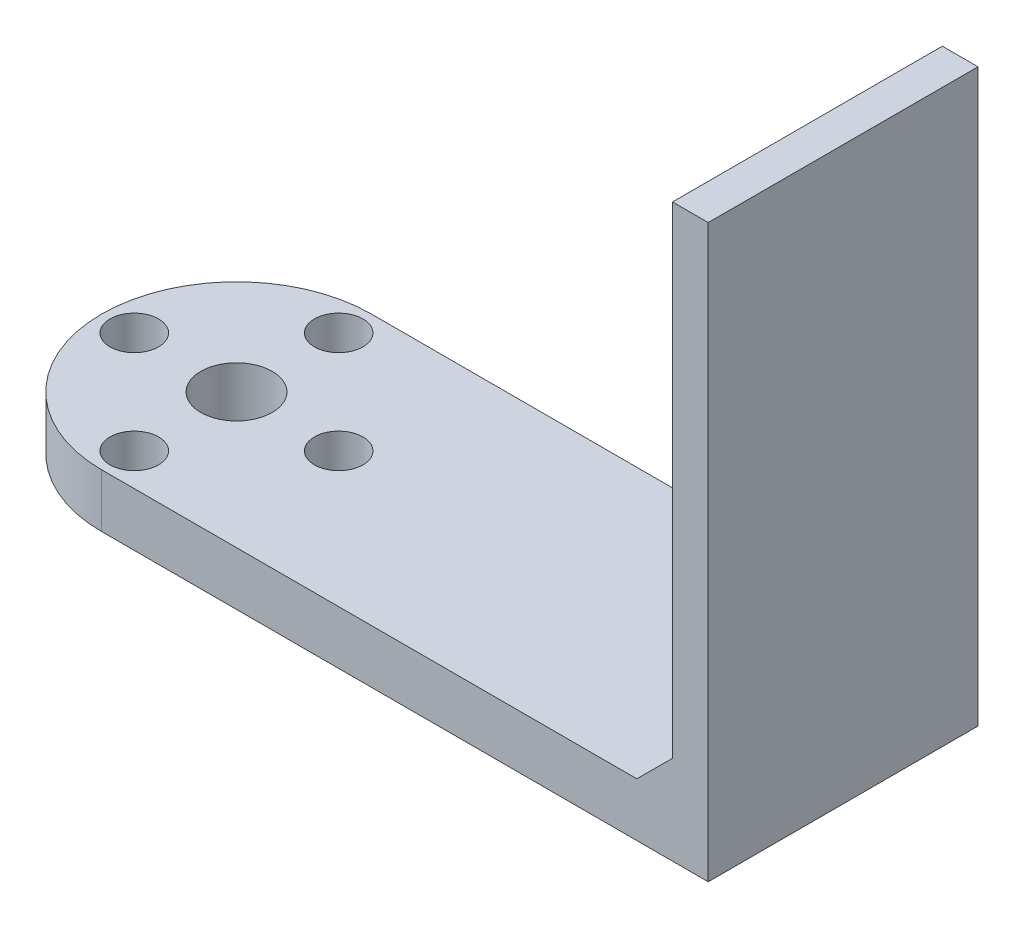
ISO-10303-21;
HEADER;
FILE_DESCRIPTION(('STEP AP214'),'2;1');
FILE_NAME('part.step','',(''),(''),'','','');
FILE_SCHEMA(('AUTOMOTIVE_DESIGN { 1 0 10303 214 1 1 1 1 }'));
ENDSEC;
DATA;
#1=APPLICATION_CONTEXT('core data for automotive mechanical design processes');
#2=APPLICATION_PROTOCOL_DEFINITION('international standard','automotive_design',2000,#1);
#3=PRODUCT_CONTEXT('',#1,'mechanical');
#4=PRODUCT('Part','Part','',(#3));
#5=PRODUCT_RELATED_PRODUCT_CATEGORY('part','',(#4));
#6=PRODUCT_DEFINITION_FORMATION('','',#4);
#7=PRODUCT_DEFINITION_CONTEXT('part definition',#1,'design');
#8=PRODUCT_DEFINITION('design','',#6,#7);
#9=PRODUCT_DEFINITION_SHAPE('','',#8);
#10=(LENGTH_UNIT() NAMED_UNIT(*) SI_UNIT(.MILLI.,.METRE.));
#11=(NAMED_UNIT(*) PLANE_ANGLE_UNIT() SI_UNIT($,.RADIAN.));
#12=(NAMED_UNIT(*) SI_UNIT($,.STERADIAN.) SOLID_ANGLE_UNIT());
#13=UNCERTAINTY_MEASURE_WITH_UNIT(LENGTH_MEASURE(1.E-05),#10,'distance_accuracy_value','');
#14=(GEOMETRIC_REPRESENTATION_CONTEXT(3) GLOBAL_UNCERTAINTY_ASSIGNED_CONTEXT((#13)) GLOBAL_UNIT_ASSIGNED_CONTEXT((#10,
#11,#12)) REPRESENTATION_CONTEXT('',''));
#15=CARTESIAN_POINT('',(0.,0.,0.));
#16=DIRECTION('',(0.,0.,1.));
#17=DIRECTION('',(1.,0.,0.));
#18=AXIS2_PLACEMENT_3D('',#15,#16,#17);
#19=CARTESIAN_POINT('',(0.,4.7625,-12.0015));
#20=DIRECTION('',(0.,0.,1.));
#21=DIRECTION('',(1.,0.,0.));
#22=AXIS2_PLACEMENT_3D('',#19,#20,#21);
#23=PLANE('',#22);
#24=DIRECTION('',(-1.,0.,0.));
#25=VECTOR('',#24,1.);
#26=CARTESIAN_POINT('',(0.,0.,-12.0015));
#27=LINE('',#26,#25);
#28=CARTESIAN_POINT('',(53.975,0.,-12.0015));
#29=VERTEX_POINT('',#28);
#30=CARTESIAN_POINT('',(0.,0.,-12.0015));
#31=VERTEX_POINT('',#30);
#32=EDGE_CURVE('E142',#29,#31,#27,.T.);
#33=ORIENTED_EDGE('',*,*,#32,.T.);
#34=DIRECTION('',(0.,-1.,0.));
#35=VECTOR('',#34,1.);
#36=CARTESIAN_POINT('',(0.,4.7625,-12.0015));
#37=LINE('',#36,#35);
#38=CARTESIAN_POINT('',(0.,4.7625,-12.0015));
#39=VERTEX_POINT('',#38);
#40=EDGE_CURVE('E144',#39,#31,#37,.T.);
#41=ORIENTED_EDGE('',*,*,#40,.F.);
#42=DIRECTION('',(-1.,0.,0.));
#43=VECTOR('',#42,1.);
#44=CARTESIAN_POINT('',(0.,4.7625,-12.0015));
#45=LINE('',#44,#43);
#46=CARTESIAN_POINT('',(47.625,4.7625,-12.0015));
#47=VERTEX_POINT('',#46);
#48=EDGE_CURVE('E172',#47,#39,#45,.T.);
#49=ORIENTED_EDGE('',*,*,#48,.F.);
#50=DIRECTION('',(0.707106781186544,0.707106781186551,0.));
#51=VECTOR('',#50,1.);
#52=CARTESIAN_POINT('',(23.8125000000002,-19.05,-12.0015));
#53=LINE('',#52,#51);
#54=CARTESIAN_POINT('',(50.8,7.93750000000001,-12.0015));
#55=VERTEX_POINT('',#54);
#56=EDGE_CURVE('E11',#47,#55,#53,.T.);
#57=ORIENTED_EDGE('',*,*,#56,.T.);
#58=DIRECTION('',(0.,-1.,0.));
#59=VECTOR('',#58,1.);
#60=CARTESIAN_POINT('',(50.8,50.8,-12.0015));
#61=LINE('',#60,#59);
#62=CARTESIAN_POINT('',(50.8,50.8,-12.0015));
#63=VERTEX_POINT('',#62);
#64=EDGE_CURVE('E95',#63,#55,#61,.T.);
#65=ORIENTED_EDGE('',*,*,#64,.F.);
#66=DIRECTION('',(-1.,0.,0.));
#67=VECTOR('',#66,1.);
#68=CARTESIAN_POINT('',(0.,50.8,-12.0015));
#69=LINE('',#68,#67);
#70=CARTESIAN_POINT('',(53.975,50.8,-12.0015));
#71=VERTEX_POINT('',#70);
#72=EDGE_CURVE('E102',#71,#63,#69,.T.);
#73=ORIENTED_EDGE('',*,*,#72,.F.);
#74=DIRECTION('',(0.,-1.,0.));
#75=VECTOR('',#74,1.);
#76=CARTESIAN_POINT('',(53.975,50.8,-12.0015));
#77=LINE('',#76,#75);
#78=EDGE_CURVE('E132',#71,#29,#77,.T.);
#79=ORIENTED_EDGE('',*,*,#78,.T.);
#80=EDGE_LOOP('',(#33,#41,#49,#57,#65,#73,#79));
#81=FACE_BOUND('',#80,.T.);
#82=ADVANCED_FACE('F33',(#81),#23,.F.);
#83=CARTESIAN_POINT('',(0.,4.7625,0.));
#84=DIRECTION('',(0.,-1.,0.));
#85=DIRECTION('',(0.,0.,-1.));
#86=AXIS2_PLACEMENT_3D('',#83,#84,#85);
#87=CYLINDRICAL_SURFACE('',#86,12.0015);
#88=CARTESIAN_POINT('',(0.,0.,0.));
#89=DIRECTION('',(0.,1.,0.));
#90=DIRECTION('',(0.,0.,1.));
#91=AXIS2_PLACEMENT_3D('',#88,#89,#90);
#92=CIRCLE('',#91,12.0015);
#93=CARTESIAN_POINT('',(0.,0.,12.0015));
#94=VERTEX_POINT('',#93);
#95=EDGE_CURVE('E146',#31,#94,#92,.T.);
#96=ORIENTED_EDGE('',*,*,#95,.T.);
#97=DIRECTION('',(0.,-1.,0.));
#98=VECTOR('',#97,1.);
#99=CARTESIAN_POINT('',(0.,4.7625,12.0015));
#100=LINE('',#99,#98);
#101=CARTESIAN_POINT('',(0.,4.7625,12.0015));
#102=VERTEX_POINT('',#101);
#103=EDGE_CURVE('E159',#102,#94,#100,.T.);
#104=ORIENTED_EDGE('',*,*,#103,.F.);
#105=CARTESIAN_POINT('',(0.,4.7625,0.));
#106=DIRECTION('',(0.,1.,0.));
#107=DIRECTION('',(0.,0.,1.));
#108=AXIS2_PLACEMENT_3D('',#105,#106,#107);
#109=CIRCLE('',#108,12.0015);
#110=EDGE_CURVE('E171',#39,#102,#109,.T.);
#111=ORIENTED_EDGE('',*,*,#110,.F.);
#112=ORIENTED_EDGE('',*,*,#40,.T.);
#113=EDGE_LOOP('',(#96,#104,#111,#112));
#114=FACE_BOUND('',#113,.T.);
#115=ADVANCED_FACE('F180',(#114),#87,.T.);
#116=CARTESIAN_POINT('',(0.,4.7625,12.0015));
#117=DIRECTION('',(0.,0.,1.));
#118=DIRECTION('',(1.,0.,0.));
#119=AXIS2_PLACEMENT_3D('',#116,#117,#118);
#120=PLANE('',#119);
#121=DIRECTION('',(-1.,0.,0.));
#122=VECTOR('',#121,1.);
#123=CARTESIAN_POINT('',(0.,0.,12.0015));
#124=LINE('',#123,#122);
#125=CARTESIAN_POINT('',(53.975,0.,12.0015));
#126=VERTEX_POINT('',#125);
#127=EDGE_CURVE('E150',#126,#94,#124,.T.);
#128=ORIENTED_EDGE('',*,*,#127,.F.);
#129=DIRECTION('',(0.,-1.,0.));
#130=VECTOR('',#129,1.);
#131=CARTESIAN_POINT('',(53.975,50.8,12.0015));
#132=LINE('',#131,#130);
#133=CARTESIAN_POINT('',(53.975,50.8,12.0015));
#134=VERTEX_POINT('',#133);
#135=EDGE_CURVE('E120',#134,#126,#132,.T.);
#136=ORIENTED_EDGE('',*,*,#135,.F.);
#137=DIRECTION('',(-1.,0.,0.));
#138=VECTOR('',#137,1.);
#139=CARTESIAN_POINT('',(0.,50.8,12.0015));
#140=LINE('',#139,#138);
#141=CARTESIAN_POINT('',(50.8,50.8,12.0015));
#142=VERTEX_POINT('',#141);
#143=EDGE_CURVE('E101',#134,#142,#140,.T.);
#144=ORIENTED_EDGE('',*,*,#143,.T.);
#145=DIRECTION('',(0.,-1.,0.));
#146=VECTOR('',#145,1.);
#147=CARTESIAN_POINT('',(50.8,50.8,12.0015));
#148=LINE('',#147,#146);
#149=CARTESIAN_POINT('',(50.8,7.93750000000001,12.0015));
#150=VERTEX_POINT('',#149);
#151=EDGE_CURVE('E97',#142,#150,#148,.T.);
#152=ORIENTED_EDGE('',*,*,#151,.T.);
#153=DIRECTION('',(-0.707106781186544,-0.707106781186551,0.));
#154=VECTOR('',#153,1.);
#155=CARTESIAN_POINT('',(50.8,7.93750000000002,12.0015));
#156=LINE('',#155,#154);
#157=CARTESIAN_POINT('',(47.625,4.7625,12.0015));
#158=VERTEX_POINT('',#157);
#159=EDGE_CURVE('E41',#150,#158,#156,.T.);
#160=ORIENTED_EDGE('',*,*,#159,.T.);
#161=DIRECTION('',(-1.,0.,0.));
#162=VECTOR('',#161,1.);
#163=CARTESIAN_POINT('',(0.,4.7625,12.0015));
#164=LINE('',#163,#162);
#165=EDGE_CURVE('E161',#158,#102,#164,.T.);
#166=ORIENTED_EDGE('',*,*,#165,.T.);
#167=ORIENTED_EDGE('',*,*,#103,.T.);
#168=EDGE_LOOP('',(#128,#136,#144,#152,#160,#166,#167));
#169=FACE_BOUND('',#168,.T.);
#170=ADVANCED_FACE('F137',(#169),#120,.T.);
#171=CARTESIAN_POINT('',(0.,4.7625,0.));
#172=DIRECTION('',(0.,-1.,0.));
#173=DIRECTION('',(0.,0.,-1.));
#174=AXIS2_PLACEMENT_3D('',#171,#172,#173);
#175=CYLINDRICAL_SURFACE('',#174,3.175);
#176=CARTESIAN_POINT('',(0.,4.7625,0.));
#177=DIRECTION('',(0.,1.,0.));
#178=DIRECTION('',(0.,0.,1.));
#179=AXIS2_PLACEMENT_3D('',#176,#177,#178);
#180=CIRCLE('',#179,3.175);
#181=CARTESIAN_POINT('',(0.,4.7625,-3.175));
#182=VERTEX_POINT('',#181);
#183=EDGE_CURVE('E240',#182,#182,#180,.T.);
#184=CARTESIAN_POINT('',(0.,0.,0.));
#185=DIRECTION('',(0.,1.,0.));
#186=DIRECTION('',(0.,0.,1.));
#187=AXIS2_PLACEMENT_3D('',#184,#185,#186);
#188=CIRCLE('',#187,3.175);
#189=CARTESIAN_POINT('',(0.,0.,-3.175));
#190=VERTEX_POINT('',#189);
#191=EDGE_CURVE('E147',#190,#190,#188,.T.);
#192=CARTESIAN_POINT('',(0.,4.7625,-3.175));
#193=CARTESIAN_POINT('',(0.,4.712890625,-3.175));
#194=CARTESIAN_POINT('',(0.,4.66328125,-3.175));
#195=CARTESIAN_POINT('',(0.,4.5640625,-3.175));
#196=CARTESIAN_POINT('',(0.,4.514453125,-3.175));
#197=CARTESIAN_POINT('',(0.,4.415234375,-3.175));
#198=CARTESIAN_POINT('',(0.,4.365625,-3.175));
#199=CARTESIAN_POINT('',(0.,4.26640625,-3.175));
#200=CARTESIAN_POINT('',(0.,4.216796875,-3.175));
#201=CARTESIAN_POINT('',(0.,4.117578125,-3.175));
#202=CARTESIAN_POINT('',(0.,4.06796875,-3.175));
#203=CARTESIAN_POINT('',(0.,3.96875,-3.175));
#204=CARTESIAN_POINT('',(0.,3.919140625,-3.175));
#205=CARTESIAN_POINT('',(0.,3.819921875,-3.175));
#206=CARTESIAN_POINT('',(0.,3.7703125,-3.175));
#207=CARTESIAN_POINT('',(0.,3.67109375,-3.175));
#208=CARTESIAN_POINT('',(0.,3.621484375,-3.175));
#209=CARTESIAN_POINT('',(0.,3.522265625,-3.175));
#210=CARTESIAN_POINT('',(0.,3.47265625,-3.175));
#211=CARTESIAN_POINT('',(0.,3.3734375,-3.175));
#212=CARTESIAN_POINT('',(0.,3.323828125,-3.175));
#213=CARTESIAN_POINT('',(0.,3.224609375,-3.175));
#214=CARTESIAN_POINT('',(0.,3.175,-3.175));
#215=CARTESIAN_POINT('',(0.,3.07578125,-3.175));
#216=CARTESIAN_POINT('',(0.,3.026171875,-3.175));
#217=CARTESIAN_POINT('',(0.,2.926953125,-3.175));
#218=CARTESIAN_POINT('',(0.,2.87734375,-3.175));
#219=CARTESIAN_POINT('',(0.,2.778125,-3.175));
#220=CARTESIAN_POINT('',(0.,2.728515625,-3.175));
#221=CARTESIAN_POINT('',(0.,2.629296875,-3.175));
#222=CARTESIAN_POINT('',(0.,2.5796875,-3.175));
#223=CARTESIAN_POINT('',(0.,2.48046875,-3.175));
#224=CARTESIAN_POINT('',(0.,2.430859375,-3.175));
#225=CARTESIAN_POINT('',(0.,2.331640625,-3.175));
#226=CARTESIAN_POINT('',(0.,2.28203125,-3.175));
#227=CARTESIAN_POINT('',(0.,2.1828125,-3.175));
#228=CARTESIAN_POINT('',(0.,2.133203125,-3.175));
#229=CARTESIAN_POINT('',(0.,2.033984375,-3.175));
#230=CARTESIAN_POINT('',(0.,1.984375,-3.175));
#231=CARTESIAN_POINT('',(0.,1.88515625,-3.175));
#232=CARTESIAN_POINT('',(0.,1.835546875,-3.175));
#233=CARTESIAN_POINT('',(0.,1.736328125,-3.175));
#234=CARTESIAN_POINT('',(0.,1.68671875,-3.175));
#235=CARTESIAN_POINT('',(0.,1.5875,-3.175));
#236=CARTESIAN_POINT('',(0.,1.537890625,-3.175));
#237=CARTESIAN_POINT('',(0.,1.438671875,-3.175));
#238=CARTESIAN_POINT('',(0.,1.3890625,-3.175));
#239=CARTESIAN_POINT('',(0.,1.28984375,-3.175));
#240=CARTESIAN_POINT('',(0.,1.240234375,-3.175));
#241=CARTESIAN_POINT('',(0.,1.141015625,-3.175));
#242=CARTESIAN_POINT('',(0.,1.09140625,-3.175));
#243=CARTESIAN_POINT('',(0.,0.9921875,-3.175));
#244=CARTESIAN_POINT('',(0.,0.942578125,-3.175));
#245=CARTESIAN_POINT('',(0.,0.843359375,-3.175));
#246=CARTESIAN_POINT('',(0.,0.79375,-3.175));
#247=CARTESIAN_POINT('',(0.,0.69453125,-3.175));
#248=CARTESIAN_POINT('',(0.,0.644921875,-3.175));
#249=CARTESIAN_POINT('',(0.,0.545703125,-3.175));
#250=CARTESIAN_POINT('',(0.,0.49609375,-3.175));
#251=CARTESIAN_POINT('',(0.,0.396875,-3.175));
#252=CARTESIAN_POINT('',(0.,0.347265625,-3.175));
#253=CARTESIAN_POINT('',(0.,0.248046875,-3.175));
#254=CARTESIAN_POINT('',(0.,0.1984375,-3.175));
#255=CARTESIAN_POINT('',(0.,0.09921875,-3.175));
#256=CARTESIAN_POINT('',(0.,0.049609375,-3.175));
#257=CARTESIAN_POINT('',(0.,0.,-3.175));
#258=B_SPLINE_CURVE_WITH_KNOTS('',3,(#192,#193,#194,#195,#196,#197,#198,#199,#200,#201,#202,
#203,#204,#205,#206,#207,#208,#209,#210,#211,#212,#213,#214,#215,#216,#217,#218,#219,#220,#221,
#222,#223,#224,#225,#226,#227,#228,#229,#230,#231,#232,#233,#234,#235,#236,#237,#238,#239,#240,
#241,#242,#243,#244,#245,#246,#247,#248,#249,#250,#251,#252,#253,#254,#255,#256,#257),
.UNSPECIFIED.,.F.,.F.,(4,2,2,2,2,2,2,2,2,2,2,2,2,2,2,2,2,2,2,2,2,2,2,2,2,2,2,2,2,2,2,2,4),(0.,
0.148828124999999,0.297656249999999,0.446484374999999,0.595312499999999,0.744140625,0.89296875,
1.041796875,1.190625,1.339453125,1.48828125,1.637109375,1.7859375,1.934765625,2.08359375,
2.232421875,2.38125,2.530078125,2.67890625,2.827734375,2.9765625,3.125390625,3.27421875,
3.423046875,3.571875,3.720703125,3.86953125,4.018359375,4.1671875,4.316015625,4.46484375,
4.613671875,4.7625),.UNSPECIFIED.);
#259=EDGE_CURVE('BSEAM189',#182,#190,#258,.T.);
#260=ORIENTED_EDGE('',*,*,#183,.T.);
#261=ORIENTED_EDGE('',*,*,#191,.F.);
#262=ORIENTED_EDGE('',*,*,#259,.T.);
#263=ORIENTED_EDGE('',*,*,#259,.F.);
#264=EDGE_LOOP('',(#260,#262,#261,#263));
#265=FACE_BOUND('',#264,.T.);
#266=ADVANCED_FACE('F189',(#265),#175,.F.);
#267=CARTESIAN_POINT('',(0.,4.7625,-9.0932));
#268=DIRECTION('',(0.,-1.,0.));
#269=DIRECTION('',(0.,0.,-1.));
#270=AXIS2_PLACEMENT_3D('',#267,#268,#269);
#271=CYLINDRICAL_SURFACE('',#270,2.159);
#272=CARTESIAN_POINT('',(0.,4.7625,-9.0932));
#273=DIRECTION('',(0.,1.,0.));
#274=DIRECTION('',(0.,0.,1.));
#275=AXIS2_PLACEMENT_3D('',#272,#273,#274);
#276=CIRCLE('',#275,2.159);
#277=CARTESIAN_POINT('',(0.,4.7625,-11.2522));
#278=VERTEX_POINT('',#277);
#279=EDGE_CURVE('E243',#278,#278,#276,.T.);
#280=CARTESIAN_POINT('',(0.,0.,-9.0932));
#281=DIRECTION('',(0.,1.,0.));
#282=DIRECTION('',(0.,0.,1.));
#283=AXIS2_PLACEMENT_3D('',#280,#281,#282);
#284=CIRCLE('',#283,2.159);
#285=CARTESIAN_POINT('',(0.,0.,-11.2522));
#286=VERTEX_POINT('',#285);
#287=EDGE_CURVE('E153',#286,#286,#284,.T.);
#288=CARTESIAN_POINT('',(0.,4.7625,-11.2522));
#289=CARTESIAN_POINT('',(0.,4.712890625,-11.2522));
#290=CARTESIAN_POINT('',(0.,4.66328125,-11.2522));
#291=CARTESIAN_POINT('',(0.,4.5640625,-11.2522));
#292=CARTESIAN_POINT('',(0.,4.514453125,-11.2522));
#293=CARTESIAN_POINT('',(0.,4.415234375,-11.2522));
#294=CARTESIAN_POINT('',(0.,4.365625,-11.2522));
#295=CARTESIAN_POINT('',(0.,4.26640625,-11.2522));
#296=CARTESIAN_POINT('',(0.,4.216796875,-11.2522));
#297=CARTESIAN_POINT('',(0.,4.117578125,-11.2522));
#298=CARTESIAN_POINT('',(0.,4.06796875,-11.2522));
#299=CARTESIAN_POINT('',(0.,3.96875,-11.2522));
#300=CARTESIAN_POINT('',(0.,3.919140625,-11.2522));
#301=CARTESIAN_POINT('',(0.,3.819921875,-11.2522));
#302=CARTESIAN_POINT('',(0.,3.7703125,-11.2522));
#303=CARTESIAN_POINT('',(0.,3.67109375,-11.2522));
#304=CARTESIAN_POINT('',(0.,3.621484375,-11.2522));
#305=CARTESIAN_POINT('',(0.,3.522265625,-11.2522));
#306=CARTESIAN_POINT('',(0.,3.47265625,-11.2522));
#307=CARTESIAN_POINT('',(0.,3.3734375,-11.2522));
#308=CARTESIAN_POINT('',(0.,3.323828125,-11.2522));
#309=CARTESIAN_POINT('',(0.,3.224609375,-11.2522));
#310=CARTESIAN_POINT('',(0.,3.175,-11.2522));
#311=CARTESIAN_POINT('',(0.,3.07578125,-11.2522));
#312=CARTESIAN_POINT('',(0.,3.026171875,-11.2522));
#313=CARTESIAN_POINT('',(0.,2.926953125,-11.2522));
#314=CARTESIAN_POINT('',(0.,2.87734375,-11.2522));
#315=CARTESIAN_POINT('',(0.,2.778125,-11.2522));
#316=CARTESIAN_POINT('',(0.,2.728515625,-11.2522));
#317=CARTESIAN_POINT('',(0.,2.629296875,-11.2522));
#318=CARTESIAN_POINT('',(0.,2.5796875,-11.2522));
#319=CARTESIAN_POINT('',(0.,2.48046875,-11.2522));
#320=CARTESIAN_POINT('',(0.,2.430859375,-11.2522));
#321=CARTESIAN_POINT('',(0.,2.331640625,-11.2522));
#322=CARTESIAN_POINT('',(0.,2.28203125,-11.2522));
#323=CARTESIAN_POINT('',(0.,2.1828125,-11.2522));
#324=CARTESIAN_POINT('',(0.,2.133203125,-11.2522));
#325=CARTESIAN_POINT('',(0.,2.033984375,-11.2522));
#326=CARTESIAN_POINT('',(0.,1.984375,-11.2522));
#327=CARTESIAN_POINT('',(0.,1.88515625,-11.2522));
#328=CARTESIAN_POINT('',(0.,1.835546875,-11.2522));
#329=CARTESIAN_POINT('',(0.,1.736328125,-11.2522));
#330=CARTESIAN_POINT('',(0.,1.68671875,-11.2522));
#331=CARTESIAN_POINT('',(0.,1.5875,-11.2522));
#332=CARTESIAN_POINT('',(0.,1.537890625,-11.2522));
#333=CARTESIAN_POINT('',(0.,1.438671875,-11.2522));
#334=CARTESIAN_POINT('',(0.,1.3890625,-11.2522));
#335=CARTESIAN_POINT('',(0.,1.28984375,-11.2522));
#336=CARTESIAN_POINT('',(0.,1.240234375,-11.2522));
#337=CARTESIAN_POINT('',(0.,1.141015625,-11.2522));
#338=CARTESIAN_POINT('',(0.,1.09140625,-11.2522));
#339=CARTESIAN_POINT('',(0.,0.9921875,-11.2522));
#340=CARTESIAN_POINT('',(0.,0.942578125,-11.2522));
#341=CARTESIAN_POINT('',(0.,0.843359375,-11.2522));
#342=CARTESIAN_POINT('',(0.,0.79375,-11.2522));
#343=CARTESIAN_POINT('',(0.,0.69453125,-11.2522));
#344=CARTESIAN_POINT('',(0.,0.644921875,-11.2522));
#345=CARTESIAN_POINT('',(0.,0.545703125,-11.2522));
#346=CARTESIAN_POINT('',(0.,0.49609375,-11.2522));
#347=CARTESIAN_POINT('',(0.,0.396875,-11.2522));
#348=CARTESIAN_POINT('',(0.,0.347265625,-11.2522));
#349=CARTESIAN_POINT('',(0.,0.248046875,-11.2522));
#350=CARTESIAN_POINT('',(0.,0.1984375,-11.2522));
#351=CARTESIAN_POINT('',(0.,0.09921875,-11.2522));
#352=CARTESIAN_POINT('',(0.,0.049609375,-11.2522));
#353=CARTESIAN_POINT('',(0.,0.,-11.2522));
#354=B_SPLINE_CURVE_WITH_KNOTS('',3,(#288,#289,#290,#291,#292,#293,#294,#295,#296,#297,#298,
#299,#300,#301,#302,#303,#304,#305,#306,#307,#308,#309,#310,#311,#312,#313,#314,#315,#316,#317,
#318,#319,#320,#321,#322,#323,#324,#325,#326,#327,#328,#329,#330,#331,#332,#333,#334,#335,#336,
#337,#338,#339,#340,#341,#342,#343,#344,#345,#346,#347,#348,#349,#350,#351,#352,#353),
.UNSPECIFIED.,.F.,.F.,(4,2,2,2,2,2,2,2,2,2,2,2,2,2,2,2,2,2,2,2,2,2,2,2,2,2,2,2,2,2,2,2,4),(0.,
0.148828124999999,0.297656249999999,0.446484374999999,0.595312499999999,0.744140625,0.89296875,
1.041796875,1.190625,1.339453125,1.48828125,1.637109375,1.7859375,1.934765625,2.08359375,
2.232421875,2.38125,2.530078125,2.67890625,2.827734375,2.9765625,3.125390625,3.27421875,
3.423046875,3.571875,3.720703125,3.86953125,4.018359375,4.1671875,4.316015625,4.46484375,
4.613671875,4.7625),.UNSPECIFIED.);
#355=EDGE_CURVE('BSEAM192',#278,#286,#354,.T.);
#356=ORIENTED_EDGE('',*,*,#279,.T.);
#357=ORIENTED_EDGE('',*,*,#287,.F.);
#358=ORIENTED_EDGE('',*,*,#355,.T.);
#359=ORIENTED_EDGE('',*,*,#355,.F.);
#360=EDGE_LOOP('',(#356,#358,#357,#359));
#361=FACE_BOUND('',#360,.T.);
#362=ADVANCED_FACE('F192',(#361),#271,.F.);
#363=CARTESIAN_POINT('',(9.09320000000026,4.7625,-2.57330692365149E-13));
#364=DIRECTION('',(0.,-1.,0.));
#365=DIRECTION('',(0.,0.,-1.));
#366=AXIS2_PLACEMENT_3D('',#363,#364,#365);
#367=CYLINDRICAL_SURFACE('',#366,2.1590000000002);
#368=CARTESIAN_POINT('',(9.09320000000026,4.7625,-2.57330692365149E-13));
#369=DIRECTION('',(0.,1.,0.));
#370=DIRECTION('',(0.,0.,1.));
#371=AXIS2_PLACEMENT_3D('',#368,#369,#370);
#372=CIRCLE('',#371,2.1590000000002);
#373=CARTESIAN_POINT('',(9.09320000000026,4.7625,-2.15900000000046));
#374=VERTEX_POINT('',#373);
#375=EDGE_CURVE('E246',#374,#374,#372,.T.);
#376=CARTESIAN_POINT('',(9.09320000000026,0.,-2.57330692365149E-13));
#377=DIRECTION('',(0.,1.,0.));
#378=DIRECTION('',(0.,0.,1.));
#379=AXIS2_PLACEMENT_3D('',#376,#377,#378);
#380=CIRCLE('',#379,2.1590000000002);
#381=CARTESIAN_POINT('',(9.09320000000026,0.,-2.15900000000046));
#382=VERTEX_POINT('',#381);
#383=EDGE_CURVE('E228',#382,#382,#380,.T.);
#384=CARTESIAN_POINT('',(9.09320000000026,4.7625,-2.15900000000046));
#385=CARTESIAN_POINT('',(9.09320000000026,4.712890625,-2.15900000000046));
#386=CARTESIAN_POINT('',(9.09320000000026,4.66328125,-2.15900000000046));
#387=CARTESIAN_POINT('',(9.09320000000026,4.5640625,-2.15900000000046));
#388=CARTESIAN_POINT('',(9.09320000000026,4.514453125,-2.15900000000046));
#389=CARTESIAN_POINT('',(9.09320000000026,4.415234375,-2.15900000000046));
#390=CARTESIAN_POINT('',(9.09320000000026,4.365625,-2.15900000000046));
#391=CARTESIAN_POINT('',(9.09320000000026,4.26640625,-2.15900000000046));
#392=CARTESIAN_POINT('',(9.09320000000026,4.216796875,-2.15900000000046));
#393=CARTESIAN_POINT('',(9.09320000000026,4.117578125,-2.15900000000046));
#394=CARTESIAN_POINT('',(9.09320000000026,4.06796875,-2.15900000000046));
#395=CARTESIAN_POINT('',(9.09320000000026,3.96875,-2.15900000000046));
#396=CARTESIAN_POINT('',(9.09320000000026,3.919140625,-2.15900000000046));
#397=CARTESIAN_POINT('',(9.09320000000026,3.819921875,-2.15900000000046));
#398=CARTESIAN_POINT('',(9.09320000000026,3.7703125,-2.15900000000046));
#399=CARTESIAN_POINT('',(9.09320000000026,3.67109375,-2.15900000000046));
#400=CARTESIAN_POINT('',(9.09320000000026,3.621484375,-2.15900000000046));
#401=CARTESIAN_POINT('',(9.09320000000026,3.522265625,-2.15900000000046));
#402=CARTESIAN_POINT('',(9.09320000000026,3.47265625,-2.15900000000046));
#403=CARTESIAN_POINT('',(9.09320000000026,3.3734375,-2.15900000000046));
#404=CARTESIAN_POINT('',(9.09320000000026,3.323828125,-2.15900000000046));
#405=CARTESIAN_POINT('',(9.09320000000026,3.224609375,-2.15900000000046));
#406=CARTESIAN_POINT('',(9.09320000000026,3.175,-2.15900000000046));
#407=CARTESIAN_POINT('',(9.09320000000026,3.07578125,-2.15900000000046));
#408=CARTESIAN_POINT('',(9.09320000000026,3.026171875,-2.15900000000046));
#409=CARTESIAN_POINT('',(9.09320000000026,2.926953125,-2.15900000000046));
#410=CARTESIAN_POINT('',(9.09320000000026,2.87734375,-2.15900000000046));
#411=CARTESIAN_POINT('',(9.09320000000026,2.778125,-2.15900000000046));
#412=CARTESIAN_POINT('',(9.09320000000026,2.728515625,-2.15900000000046));
#413=CARTESIAN_POINT('',(9.09320000000026,2.629296875,-2.15900000000046));
#414=CARTESIAN_POINT('',(9.09320000000026,2.5796875,-2.15900000000046));
#415=CARTESIAN_POINT('',(9.09320000000026,2.48046875,-2.15900000000046));
#416=CARTESIAN_POINT('',(9.09320000000026,2.430859375,-2.15900000000046));
#417=CARTESIAN_POINT('',(9.09320000000026,2.331640625,-2.15900000000046));
#418=CARTESIAN_POINT('',(9.09320000000026,2.28203125,-2.15900000000046));
#419=CARTESIAN_POINT('',(9.09320000000026,2.1828125,-2.15900000000046));
#420=CARTESIAN_POINT('',(9.09320000000026,2.133203125,-2.15900000000046));
#421=CARTESIAN_POINT('',(9.09320000000026,2.033984375,-2.15900000000046));
#422=CARTESIAN_POINT('',(9.09320000000026,1.984375,-2.15900000000046));
#423=CARTESIAN_POINT('',(9.09320000000026,1.88515625,-2.15900000000046));
#424=CARTESIAN_POINT('',(9.09320000000026,1.835546875,-2.15900000000046));
#425=CARTESIAN_POINT('',(9.09320000000026,1.736328125,-2.15900000000046));
#426=CARTESIAN_POINT('',(9.09320000000026,1.68671875,-2.15900000000046));
#427=CARTESIAN_POINT('',(9.09320000000026,1.5875,-2.15900000000046));
#428=CARTESIAN_POINT('',(9.09320000000026,1.537890625,-2.15900000000046));
#429=CARTESIAN_POINT('',(9.09320000000026,1.438671875,-2.15900000000046));
#430=CARTESIAN_POINT('',(9.09320000000026,1.3890625,-2.15900000000046));
#431=CARTESIAN_POINT('',(9.09320000000026,1.28984375,-2.15900000000046));
#432=CARTESIAN_POINT('',(9.09320000000026,1.240234375,-2.15900000000046));
#433=CARTESIAN_POINT('',(9.09320000000026,1.141015625,-2.15900000000046));
#434=CARTESIAN_POINT('',(9.09320000000026,1.09140625,-2.15900000000046));
#435=CARTESIAN_POINT('',(9.09320000000026,0.9921875,-2.15900000000046));
#436=CARTESIAN_POINT('',(9.09320000000026,0.942578125,-2.15900000000046));
#437=CARTESIAN_POINT('',(9.09320000000026,0.843359375,-2.15900000000046));
#438=CARTESIAN_POINT('',(9.09320000000026,0.79375,-2.15900000000046));
#439=CARTESIAN_POINT('',(9.09320000000026,0.69453125,-2.15900000000046));
#440=CARTESIAN_POINT('',(9.09320000000026,0.644921875,-2.15900000000046));
#441=CARTESIAN_POINT('',(9.09320000000026,0.545703125,-2.15900000000046));
#442=CARTESIAN_POINT('',(9.09320000000026,0.49609375,-2.15900000000046));
#443=CARTESIAN_POINT('',(9.09320000000026,0.396875,-2.15900000000046));
#444=CARTESIAN_POINT('',(9.09320000000026,0.347265625,-2.15900000000046));
#445=CARTESIAN_POINT('',(9.09320000000026,0.248046875,-2.15900000000046));
#446=CARTESIAN_POINT('',(9.09320000000026,0.1984375,-2.15900000000046));
#447=CARTESIAN_POINT('',(9.09320000000026,0.09921875,-2.15900000000046));
#448=CARTESIAN_POINT('',(9.09320000000026,0.049609375,-2.15900000000046));
#449=CARTESIAN_POINT('',(9.09320000000026,0.,-2.15900000000046));
#450=B_SPLINE_CURVE_WITH_KNOTS('',3,(#384,#385,#386,#387,#388,#389,#390,#391,#392,#393,#394,
#395,#396,#397,#398,#399,#400,#401,#402,#403,#404,#405,#406,#407,#408,#409,#410,#411,#412,#413,
#414,#415,#416,#417,#418,#419,#420,#421,#422,#423,#424,#425,#426,#427,#428,#429,#430,#431,#432,
#433,#434,#435,#436,#437,#438,#439,#440,#441,#442,#443,#444,#445,#446,#447,#448,#449),
.UNSPECIFIED.,.F.,.F.,(4,2,2,2,2,2,2,2,2,2,2,2,2,2,2,2,2,2,2,2,2,2,2,2,2,2,2,2,2,2,2,2,4),(0.,
0.148828124999999,0.297656249999999,0.446484374999999,0.595312499999999,0.744140625,0.89296875,
1.041796875,1.190625,1.339453125,1.48828125,1.637109375,1.7859375,1.934765625,2.08359375,
2.232421875,2.38125,2.530078125,2.67890625,2.827734375,2.9765625,3.125390625,3.27421875,
3.423046875,3.571875,3.720703125,3.86953125,4.018359375,4.1671875,4.316015625,4.46484375,
4.613671875,4.7625),.UNSPECIFIED.);
#451=EDGE_CURVE('BSEAM196',#374,#382,#450,.T.);
#452=ORIENTED_EDGE('',*,*,#375,.T.);
#453=ORIENTED_EDGE('',*,*,#383,.F.);
#454=ORIENTED_EDGE('',*,*,#451,.T.);
#455=ORIENTED_EDGE('',*,*,#451,.F.);
#456=EDGE_LOOP('',(#452,#454,#453,#455));
#457=FACE_BOUND('',#456,.T.);
#458=ADVANCED_FACE('F196',(#457),#367,.F.);
#459=CARTESIAN_POINT('',(5.14661384730298E-13,4.7625,9.0932));
#460=DIRECTION('',(0.,-1.,0.));
#461=DIRECTION('',(0.,0.,-1.));
#462=AXIS2_PLACEMENT_3D('',#459,#460,#461);
#463=CYLINDRICAL_SURFACE('',#462,2.15900000000055);
#464=CARTESIAN_POINT('',(5.14661384730298E-13,4.7625,9.0932));
#465=DIRECTION('',(0.,1.,0.));
#466=DIRECTION('',(0.,0.,1.));
#467=AXIS2_PLACEMENT_3D('',#464,#465,#466);
#468=CIRCLE('',#467,2.15900000000055);
#469=CARTESIAN_POINT('',(5.14661384730298E-13,4.7625,6.93419999999945));
#470=VERTEX_POINT('',#469);
#471=EDGE_CURVE('E248',#470,#470,#468,.T.);
#472=CARTESIAN_POINT('',(5.14661384730298E-13,0.,9.0932));
#473=DIRECTION('',(0.,1.,0.));
#474=DIRECTION('',(0.,0.,1.));
#475=AXIS2_PLACEMENT_3D('',#472,#473,#474);
#476=CIRCLE('',#475,2.15900000000055);
#477=CARTESIAN_POINT('',(5.14661384730298E-13,0.,6.93419999999945));
#478=VERTEX_POINT('',#477);
#479=EDGE_CURVE('E118',#478,#478,#476,.T.);
#480=CARTESIAN_POINT('',(5.14661384730298E-13,4.7625,6.93419999999945));
#481=CARTESIAN_POINT('',(5.14661384730298E-13,4.712890625,6.93419999999945));
#482=CARTESIAN_POINT('',(5.14661384730298E-13,4.66328125,6.93419999999945));
#483=CARTESIAN_POINT('',(5.14661384730298E-13,4.5640625,6.93419999999945));
#484=CARTESIAN_POINT('',(5.14661384730298E-13,4.514453125,6.93419999999945));
#485=CARTESIAN_POINT('',(5.14661384730298E-13,4.415234375,6.93419999999945));
#486=CARTESIAN_POINT('',(5.14661384730298E-13,4.365625,6.93419999999945));
#487=CARTESIAN_POINT('',(5.14661384730298E-13,4.26640625,6.93419999999945));
#488=CARTESIAN_POINT('',(5.14661384730298E-13,4.216796875,6.93419999999945));
#489=CARTESIAN_POINT('',(5.14661384730298E-13,4.117578125,6.93419999999945));
#490=CARTESIAN_POINT('',(5.14661384730298E-13,4.06796875,6.93419999999945));
#491=CARTESIAN_POINT('',(5.14661384730298E-13,3.96875,6.93419999999945));
#492=CARTESIAN_POINT('',(5.14661384730298E-13,3.919140625,6.93419999999945));
#493=CARTESIAN_POINT('',(5.14661384730298E-13,3.819921875,6.93419999999945));
#494=CARTESIAN_POINT('',(5.14661384730298E-13,3.7703125,6.93419999999945));
#495=CARTESIAN_POINT('',(5.14661384730298E-13,3.67109375,6.93419999999945));
#496=CARTESIAN_POINT('',(5.14661384730298E-13,3.621484375,6.93419999999945));
#497=CARTESIAN_POINT('',(5.14661384730298E-13,3.522265625,6.93419999999945));
#498=CARTESIAN_POINT('',(5.14661384730298E-13,3.47265625,6.93419999999945));
#499=CARTESIAN_POINT('',(5.14661384730298E-13,3.3734375,6.93419999999945));
#500=CARTESIAN_POINT('',(5.14661384730298E-13,3.323828125,6.93419999999945));
#501=CARTESIAN_POINT('',(5.14661384730298E-13,3.224609375,6.93419999999945));
#502=CARTESIAN_POINT('',(5.14661384730298E-13,3.175,6.93419999999945));
#503=CARTESIAN_POINT('',(5.14661384730298E-13,3.07578125,6.93419999999945));
#504=CARTESIAN_POINT('',(5.14661384730298E-13,3.026171875,6.93419999999945));
#505=CARTESIAN_POINT('',(5.14661384730298E-13,2.926953125,6.93419999999945));
#506=CARTESIAN_POINT('',(5.14661384730298E-13,2.87734375,6.93419999999945));
#507=CARTESIAN_POINT('',(5.14661384730298E-13,2.778125,6.93419999999945));
#508=CARTESIAN_POINT('',(5.14661384730298E-13,2.728515625,6.93419999999945));
#509=CARTESIAN_POINT('',(5.14661384730298E-13,2.629296875,6.93419999999945));
#510=CARTESIAN_POINT('',(5.14661384730298E-13,2.5796875,6.93419999999945));
#511=CARTESIAN_POINT('',(5.14661384730298E-13,2.48046875,6.93419999999945));
#512=CARTESIAN_POINT('',(5.14661384730298E-13,2.430859375,6.93419999999945));
#513=CARTESIAN_POINT('',(5.14661384730298E-13,2.331640625,6.93419999999945));
#514=CARTESIAN_POINT('',(5.14661384730298E-13,2.28203125,6.93419999999945));
#515=CARTESIAN_POINT('',(5.14661384730298E-13,2.1828125,6.93419999999945));
#516=CARTESIAN_POINT('',(5.14661384730298E-13,2.133203125,6.93419999999945));
#517=CARTESIAN_POINT('',(5.14661384730298E-13,2.033984375,6.93419999999945));
#518=CARTESIAN_POINT('',(5.14661384730298E-13,1.984375,6.93419999999945));
#519=CARTESIAN_POINT('',(5.14661384730298E-13,1.88515625,6.93419999999945));
#520=CARTESIAN_POINT('',(5.14661384730298E-13,1.835546875,6.93419999999945));
#521=CARTESIAN_POINT('',(5.14661384730298E-13,1.736328125,6.93419999999945));
#522=CARTESIAN_POINT('',(5.14661384730298E-13,1.68671875,6.93419999999945));
#523=CARTESIAN_POINT('',(5.14661384730298E-13,1.5875,6.93419999999945));
#524=CARTESIAN_POINT('',(5.14661384730298E-13,1.537890625,6.93419999999945));
#525=CARTESIAN_POINT('',(5.14661384730298E-13,1.438671875,6.93419999999945));
#526=CARTESIAN_POINT('',(5.14661384730298E-13,1.3890625,6.93419999999945));
#527=CARTESIAN_POINT('',(5.14661384730298E-13,1.28984375,6.93419999999945));
#528=CARTESIAN_POINT('',(5.14661384730298E-13,1.240234375,6.93419999999945));
#529=CARTESIAN_POINT('',(5.14661384730298E-13,1.141015625,6.93419999999945));
#530=CARTESIAN_POINT('',(5.14661384730298E-13,1.09140625,6.93419999999945));
#531=CARTESIAN_POINT('',(5.14661384730298E-13,0.9921875,6.93419999999945));
#532=CARTESIAN_POINT('',(5.14661384730298E-13,0.942578125,6.93419999999945));
#533=CARTESIAN_POINT('',(5.14661384730298E-13,0.843359375,6.93419999999945));
#534=CARTESIAN_POINT('',(5.14661384730298E-13,0.79375,6.93419999999945));
#535=CARTESIAN_POINT('',(5.14661384730298E-13,0.69453125,6.93419999999945));
#536=CARTESIAN_POINT('',(5.14661384730298E-13,0.644921875,6.93419999999945));
#537=CARTESIAN_POINT('',(5.14661384730298E-13,0.545703125,6.93419999999945));
#538=CARTESIAN_POINT('',(5.14661384730298E-13,0.49609375,6.93419999999945));
#539=CARTESIAN_POINT('',(5.14661384730298E-13,0.396875,6.93419999999945));
#540=CARTESIAN_POINT('',(5.14661384730298E-13,0.347265625,6.93419999999945));
#541=CARTESIAN_POINT('',(5.14661384730298E-13,0.248046875,6.93419999999945));
#542=CARTESIAN_POINT('',(5.14661384730298E-13,0.1984375,6.93419999999945));
#543=CARTESIAN_POINT('',(5.14661384730298E-13,0.09921875,6.93419999999945));
#544=CARTESIAN_POINT('',(5.14661384730298E-13,0.049609375,6.93419999999945));
#545=CARTESIAN_POINT('',(5.14661384730298E-13,0.,6.93419999999945));
#546=B_SPLINE_CURVE_WITH_KNOTS('',3,(#480,#481,#482,#483,#484,#485,#486,#487,#488,#489,#490,
#491,#492,#493,#494,#495,#496,#497,#498,#499,#500,#501,#502,#503,#504,#505,#506,#507,#508,#509,
#510,#511,#512,#513,#514,#515,#516,#517,#518,#519,#520,#521,#522,#523,#524,#525,#526,#527,#528,
#529,#530,#531,#532,#533,#534,#535,#536,#537,#538,#539,#540,#541,#542,#543,#544,#545),
.UNSPECIFIED.,.F.,.F.,(4,2,2,2,2,2,2,2,2,2,2,2,2,2,2,2,2,2,2,2,2,2,2,2,2,2,2,2,2,2,2,2,4),(0.,
0.148828124999999,0.297656249999999,0.446484374999999,0.595312499999999,0.744140625,0.89296875,
1.041796875,1.190625,1.339453125,1.48828125,1.637109375,1.7859375,1.934765625,2.08359375,
2.232421875,2.38125,2.530078125,2.67890625,2.827734375,2.9765625,3.125390625,3.27421875,
3.423046875,3.571875,3.720703125,3.86953125,4.018359375,4.1671875,4.316015625,4.46484375,
4.613671875,4.7625),.UNSPECIFIED.);
#547=EDGE_CURVE('BSEAM200',#470,#478,#546,.T.);
#548=ORIENTED_EDGE('',*,*,#471,.T.);
#549=ORIENTED_EDGE('',*,*,#479,.F.);
#550=ORIENTED_EDGE('',*,*,#547,.T.);
#551=ORIENTED_EDGE('',*,*,#547,.F.);
#552=EDGE_LOOP('',(#548,#550,#549,#551));
#553=FACE_BOUND('',#552,.T.);
#554=ADVANCED_FACE('F200',(#553),#463,.F.);
#555=CARTESIAN_POINT('',(-9.09319999999974,4.7625,2.5844428819255E-13));
#556=DIRECTION('',(0.,-1.,0.));
#557=DIRECTION('',(0.,0.,-1.));
#558=AXIS2_PLACEMENT_3D('',#555,#556,#557);
#559=CYLINDRICAL_SURFACE('',#558,2.15900000000041);
#560=CARTESIAN_POINT('',(-9.09319999999974,4.7625,2.5844428819255E-13));
#561=DIRECTION('',(0.,1.,0.));
#562=DIRECTION('',(0.,0.,1.));
#563=AXIS2_PLACEMENT_3D('',#560,#561,#562);
#564=CIRCLE('',#563,2.15900000000041);
#565=CARTESIAN_POINT('',(-9.09319999999974,4.7625,-2.15900000000016));
#566=VERTEX_POINT('',#565);
#567=EDGE_CURVE('E125',#566,#566,#564,.T.);
#568=CARTESIAN_POINT('',(-9.09319999999974,0.,2.5844428819255E-13));
#569=DIRECTION('',(0.,1.,0.));
#570=DIRECTION('',(0.,0.,1.));
#571=AXIS2_PLACEMENT_3D('',#568,#569,#570);
#572=CIRCLE('',#571,2.15900000000041);
#573=CARTESIAN_POINT('',(-9.09319999999974,0.,-2.15900000000016));
#574=VERTEX_POINT('',#573);
#575=EDGE_CURVE('E115',#574,#574,#572,.T.);
#576=CARTESIAN_POINT('',(-9.09319999999974,4.7625,-2.15900000000016));
#577=CARTESIAN_POINT('',(-9.09319999999974,4.712890625,-2.15900000000016));
#578=CARTESIAN_POINT('',(-9.09319999999974,4.66328125,-2.15900000000016));
#579=CARTESIAN_POINT('',(-9.09319999999974,4.5640625,-2.15900000000016));
#580=CARTESIAN_POINT('',(-9.09319999999974,4.514453125,-2.15900000000016));
#581=CARTESIAN_POINT('',(-9.09319999999974,4.415234375,-2.15900000000016));
#582=CARTESIAN_POINT('',(-9.09319999999974,4.365625,-2.15900000000016));
#583=CARTESIAN_POINT('',(-9.09319999999974,4.26640625,-2.15900000000016));
#584=CARTESIAN_POINT('',(-9.09319999999974,4.216796875,-2.15900000000016));
#585=CARTESIAN_POINT('',(-9.09319999999974,4.117578125,-2.15900000000016));
#586=CARTESIAN_POINT('',(-9.09319999999974,4.06796875,-2.15900000000016));
#587=CARTESIAN_POINT('',(-9.09319999999974,3.96875,-2.15900000000016));
#588=CARTESIAN_POINT('',(-9.09319999999974,3.919140625,-2.15900000000016));
#589=CARTESIAN_POINT('',(-9.09319999999974,3.819921875,-2.15900000000016));
#590=CARTESIAN_POINT('',(-9.09319999999974,3.7703125,-2.15900000000016));
#591=CARTESIAN_POINT('',(-9.09319999999974,3.67109375,-2.15900000000016));
#592=CARTESIAN_POINT('',(-9.09319999999974,3.621484375,-2.15900000000016));
#593=CARTESIAN_POINT('',(-9.09319999999974,3.522265625,-2.15900000000016));
#594=CARTESIAN_POINT('',(-9.09319999999974,3.47265625,-2.15900000000016));
#595=CARTESIAN_POINT('',(-9.09319999999974,3.3734375,-2.15900000000016));
#596=CARTESIAN_POINT('',(-9.09319999999974,3.323828125,-2.15900000000016));
#597=CARTESIAN_POINT('',(-9.09319999999974,3.224609375,-2.15900000000016));
#598=CARTESIAN_POINT('',(-9.09319999999974,3.175,-2.15900000000016));
#599=CARTESIAN_POINT('',(-9.09319999999974,3.07578125,-2.15900000000016));
#600=CARTESIAN_POINT('',(-9.09319999999974,3.026171875,-2.15900000000016));
#601=CARTESIAN_POINT('',(-9.09319999999974,2.926953125,-2.15900000000016));
#602=CARTESIAN_POINT('',(-9.09319999999974,2.87734375,-2.15900000000016));
#603=CARTESIAN_POINT('',(-9.09319999999974,2.778125,-2.15900000000016));
#604=CARTESIAN_POINT('',(-9.09319999999974,2.728515625,-2.15900000000016));
#605=CARTESIAN_POINT('',(-9.09319999999974,2.629296875,-2.15900000000016));
#606=CARTESIAN_POINT('',(-9.09319999999974,2.5796875,-2.15900000000016));
#607=CARTESIAN_POINT('',(-9.09319999999974,2.48046875,-2.15900000000016));
#608=CARTESIAN_POINT('',(-9.09319999999974,2.430859375,-2.15900000000016));
#609=CARTESIAN_POINT('',(-9.09319999999974,2.331640625,-2.15900000000016));
#610=CARTESIAN_POINT('',(-9.09319999999974,2.28203125,-2.15900000000016));
#611=CARTESIAN_POINT('',(-9.09319999999974,2.1828125,-2.15900000000016));
#612=CARTESIAN_POINT('',(-9.09319999999974,2.133203125,-2.15900000000016));
#613=CARTESIAN_POINT('',(-9.09319999999974,2.033984375,-2.15900000000016));
#614=CARTESIAN_POINT('',(-9.09319999999974,1.984375,-2.15900000000016));
#615=CARTESIAN_POINT('',(-9.09319999999974,1.88515625,-2.15900000000016));
#616=CARTESIAN_POINT('',(-9.09319999999974,1.835546875,-2.15900000000016));
#617=CARTESIAN_POINT('',(-9.09319999999974,1.736328125,-2.15900000000016));
#618=CARTESIAN_POINT('',(-9.09319999999974,1.68671875,-2.15900000000016));
#619=CARTESIAN_POINT('',(-9.09319999999974,1.5875,-2.15900000000016));
#620=CARTESIAN_POINT('',(-9.09319999999974,1.537890625,-2.15900000000016));
#621=CARTESIAN_POINT('',(-9.09319999999974,1.438671875,-2.15900000000016));
#622=CARTESIAN_POINT('',(-9.09319999999974,1.3890625,-2.15900000000016));
#623=CARTESIAN_POINT('',(-9.09319999999974,1.28984375,-2.15900000000016));
#624=CARTESIAN_POINT('',(-9.09319999999974,1.240234375,-2.15900000000016));
#625=CARTESIAN_POINT('',(-9.09319999999974,1.141015625,-2.15900000000016));
#626=CARTESIAN_POINT('',(-9.09319999999974,1.09140625,-2.15900000000016));
#627=CARTESIAN_POINT('',(-9.09319999999974,0.9921875,-2.15900000000016));
#628=CARTESIAN_POINT('',(-9.09319999999974,0.942578125,-2.15900000000016));
#629=CARTESIAN_POINT('',(-9.09319999999974,0.843359375,-2.15900000000016));
#630=CARTESIAN_POINT('',(-9.09319999999974,0.79375,-2.15900000000016));
#631=CARTESIAN_POINT('',(-9.09319999999974,0.69453125,-2.15900000000016));
#632=CARTESIAN_POINT('',(-9.09319999999974,0.644921875,-2.15900000000016));
#633=CARTESIAN_POINT('',(-9.09319999999974,0.545703125,-2.15900000000016));
#634=CARTESIAN_POINT('',(-9.09319999999974,0.49609375,-2.15900000000016));
#635=CARTESIAN_POINT('',(-9.09319999999974,0.396875,-2.15900000000016));
#636=CARTESIAN_POINT('',(-9.09319999999974,0.347265625,-2.15900000000016));
#637=CARTESIAN_POINT('',(-9.09319999999974,0.248046875,-2.15900000000016));
#638=CARTESIAN_POINT('',(-9.09319999999974,0.1984375,-2.15900000000016));
#639=CARTESIAN_POINT('',(-9.09319999999974,0.09921875,-2.15900000000016));
#640=CARTESIAN_POINT('',(-9.09319999999974,0.049609375,-2.15900000000016));
#641=CARTESIAN_POINT('',(-9.09319999999974,0.,-2.15900000000016));
#642=B_SPLINE_CURVE_WITH_KNOTS('',3,(#576,#577,#578,#579,#580,#581,#582,#583,#584,#585,#586,
#587,#588,#589,#590,#591,#592,#593,#594,#595,#596,#597,#598,#599,#600,#601,#602,#603,#604,#605,
#606,#607,#608,#609,#610,#611,#612,#613,#614,#615,#616,#617,#618,#619,#620,#621,#622,#623,#624,
#625,#626,#627,#628,#629,#630,#631,#632,#633,#634,#635,#636,#637,#638,#639,#640,#641),
.UNSPECIFIED.,.F.,.F.,(4,2,2,2,2,2,2,2,2,2,2,2,2,2,2,2,2,2,2,2,2,2,2,2,2,2,2,2,2,2,2,2,4),(0.,
0.148828124999999,0.297656249999999,0.446484374999999,0.595312499999999,0.744140625,0.89296875,
1.041796875,1.190625,1.339453125,1.48828125,1.637109375,1.7859375,1.934765625,2.08359375,
2.232421875,2.38125,2.530078125,2.67890625,2.827734375,2.9765625,3.125390625,3.27421875,
3.423046875,3.571875,3.720703125,3.86953125,4.018359375,4.1671875,4.316015625,4.46484375,
4.613671875,4.7625),.UNSPECIFIED.);
#643=EDGE_CURVE('BSEAM203',#566,#574,#642,.T.);
#644=ORIENTED_EDGE('',*,*,#567,.T.);
#645=ORIENTED_EDGE('',*,*,#575,.F.);
#646=ORIENTED_EDGE('',*,*,#643,.T.);
#647=ORIENTED_EDGE('',*,*,#643,.F.);
#648=EDGE_LOOP('',(#644,#646,#645,#647));
#649=FACE_BOUND('',#648,.T.);
#650=ADVANCED_FACE('F203',(#649),#559,.F.);
#651=CARTESIAN_POINT('',(0.,4.7625,0.));
#652=DIRECTION('',(0.,1.,0.));
#653=DIRECTION('',(0.,0.,1.));
#654=AXIS2_PLACEMENT_3D('',#651,#652,#653);
#655=PLANE('',#654);
#656=ORIENTED_EDGE('',*,*,#567,.F.);
#657=EDGE_LOOP('',(#656));
#658=FACE_BOUND('',#657,.T.);
#659=ORIENTED_EDGE('',*,*,#471,.F.);
#660=EDGE_LOOP('',(#659));
#661=FACE_BOUND('',#660,.T.);
#662=ORIENTED_EDGE('',*,*,#375,.F.);
#663=EDGE_LOOP('',(#662));
#664=FACE_BOUND('',#663,.T.);
#665=ORIENTED_EDGE('',*,*,#279,.F.);
#666=EDGE_LOOP('',(#665));
#667=FACE_BOUND('',#666,.T.);
#668=ORIENTED_EDGE('',*,*,#183,.F.);
#669=EDGE_LOOP('',(#668));
#670=FACE_BOUND('',#669,.T.);
#671=ORIENTED_EDGE('',*,*,#165,.F.);
#672=DIRECTION('',(0.,0.,-1.));
#673=VECTOR('',#672,1.);
#674=CARTESIAN_POINT('',(47.625,4.7625,0.));
#675=LINE('',#674,#673);
#676=EDGE_CURVE('E54',#158,#47,#675,.T.);
#677=ORIENTED_EDGE('',*,*,#676,.T.);
#678=ORIENTED_EDGE('',*,*,#48,.T.);
#679=ORIENTED_EDGE('',*,*,#110,.T.);
#680=EDGE_LOOP('',(#671,#677,#678,#679));
#681=FACE_BOUND('',#680,.T.);
#682=ADVANCED_FACE('F206',(#658,#661,#664,#667,#670,#681),#655,.T.);
#683=CARTESIAN_POINT('',(0.,0.,0.));
#684=DIRECTION('',(0.,1.,0.));
#685=DIRECTION('',(0.,0.,1.));
#686=AXIS2_PLACEMENT_3D('',#683,#684,#685);
#687=PLANE('',#686);
#688=ORIENTED_EDGE('',*,*,#575,.T.);
#689=EDGE_LOOP('',(#688));
#690=FACE_BOUND('',#689,.T.);
#691=ORIENTED_EDGE('',*,*,#479,.T.);
#692=EDGE_LOOP('',(#691));
#693=FACE_BOUND('',#692,.T.);
#694=ORIENTED_EDGE('',*,*,#383,.T.);
#695=EDGE_LOOP('',(#694));
#696=FACE_BOUND('',#695,.T.);
#697=ORIENTED_EDGE('',*,*,#287,.T.);
#698=EDGE_LOOP('',(#697));
#699=FACE_BOUND('',#698,.T.);
#700=ORIENTED_EDGE('',*,*,#191,.T.);
#701=EDGE_LOOP('',(#700));
#702=FACE_BOUND('',#701,.T.);
#703=ORIENTED_EDGE('',*,*,#32,.F.);
#704=DIRECTION('',(0.,0.,1.));
#705=VECTOR('',#704,1.);
#706=CARTESIAN_POINT('',(53.975,0.,0.));
#707=LINE('',#706,#705);
#708=EDGE_CURVE('E111',#29,#126,#707,.T.);
#709=ORIENTED_EDGE('',*,*,#708,.T.);
#710=ORIENTED_EDGE('',*,*,#127,.T.);
#711=ORIENTED_EDGE('',*,*,#95,.F.);
#712=EDGE_LOOP('',(#703,#709,#710,#711));
#713=FACE_BOUND('',#712,.T.);
#714=ADVANCED_FACE('F211',(#690,#693,#696,#699,#702,#713),#687,.F.);
#715=CARTESIAN_POINT('',(50.8,50.8,0.));
#716=DIRECTION('',(1.,0.,0.));
#717=DIRECTION('',(0.,0.,-1.));
#718=AXIS2_PLACEMENT_3D('',#715,#716,#717);
#719=PLANE('',#718);
#720=ORIENTED_EDGE('',*,*,#64,.T.);
#721=DIRECTION('',(0.,0.,1.));
#722=VECTOR('',#721,1.);
#723=CARTESIAN_POINT('',(50.8,7.93750000000001,0.));
#724=LINE('',#723,#722);
#725=EDGE_CURVE('E163',#55,#150,#724,.T.);
#726=ORIENTED_EDGE('',*,*,#725,.T.);
#727=ORIENTED_EDGE('',*,*,#151,.F.);
#728=DIRECTION('',(0.,0.,1.));
#729=VECTOR('',#728,1.);
#730=CARTESIAN_POINT('',(50.8,50.8,0.));
#731=LINE('',#730,#729);
#732=EDGE_CURVE('E90',#63,#142,#731,.T.);
#733=ORIENTED_EDGE('',*,*,#732,.F.);
#734=EDGE_LOOP('',(#720,#726,#727,#733));
#735=FACE_BOUND('',#734,.T.);
#736=ADVANCED_FACE('F92',(#735),#719,.F.);
#737=CARTESIAN_POINT('',(53.975,50.8,0.));
#738=DIRECTION('',(1.,0.,0.));
#739=DIRECTION('',(0.,0.,-1.));
#740=AXIS2_PLACEMENT_3D('',#737,#738,#739);
#741=PLANE('',#740);
#742=ORIENTED_EDGE('',*,*,#708,.F.);
#743=ORIENTED_EDGE('',*,*,#78,.F.);
#744=DIRECTION('',(0.,0.,1.));
#745=VECTOR('',#744,1.);
#746=CARTESIAN_POINT('',(53.975,50.8,0.));
#747=LINE('',#746,#745);
#748=EDGE_CURVE('E108',#71,#134,#747,.T.);
#749=ORIENTED_EDGE('',*,*,#748,.T.);
#750=ORIENTED_EDGE('',*,*,#135,.T.);
#751=EDGE_LOOP('',(#742,#743,#749,#750));
#752=FACE_BOUND('',#751,.T.);
#753=ADVANCED_FACE('F140',(#752),#741,.T.);
#754=CARTESIAN_POINT('',(0.,50.8,0.));
#755=DIRECTION('',(0.,1.,0.));
#756=DIRECTION('',(0.,0.,1.));
#757=AXIS2_PLACEMENT_3D('',#754,#755,#756);
#758=PLANE('',#757);
#759=ORIENTED_EDGE('',*,*,#72,.T.);
#760=ORIENTED_EDGE('',*,*,#732,.T.);
#761=ORIENTED_EDGE('',*,*,#143,.F.);
#762=ORIENTED_EDGE('',*,*,#748,.F.);
#763=EDGE_LOOP('',(#759,#760,#761,#762));
#764=FACE_BOUND('',#763,.T.);
#765=ADVANCED_FACE('F106',(#764),#758,.T.);
#766=CARTESIAN_POINT('',(50.8,7.93750000000001,0.));
#767=DIRECTION('',(0.707106781186551,-0.707106781186544,0.));
#768=DIRECTION('',(0.,0.,1.));
#769=AXIS2_PLACEMENT_3D('',#766,#767,#768);
#770=PLANE('',#769);
#771=ORIENTED_EDGE('',*,*,#56,.F.);
#772=ORIENTED_EDGE('',*,*,#676,.F.);
#773=ORIENTED_EDGE('',*,*,#159,.F.);
#774=ORIENTED_EDGE('',*,*,#725,.F.);
#775=EDGE_LOOP('',(#771,#772,#773,#774));
#776=FACE_BOUND('',#775,.T.);
#777=ADVANCED_FACE('F35',(#776),#770,.F.);
#778=CLOSED_SHELL('',(#82,#115,#170,#266,#362,#458,#554,#650,#682,#714,#736,#753,#765,#777));
#779=MANIFOLD_SOLID_BREP('B2',#778);
#780=ADVANCED_BREP_SHAPE_REPRESENTATION('',(#18,#779),#14);
#781=SHAPE_DEFINITION_REPRESENTATION(#9,#780);
ENDSEC;
END-ISO-10303-21;
